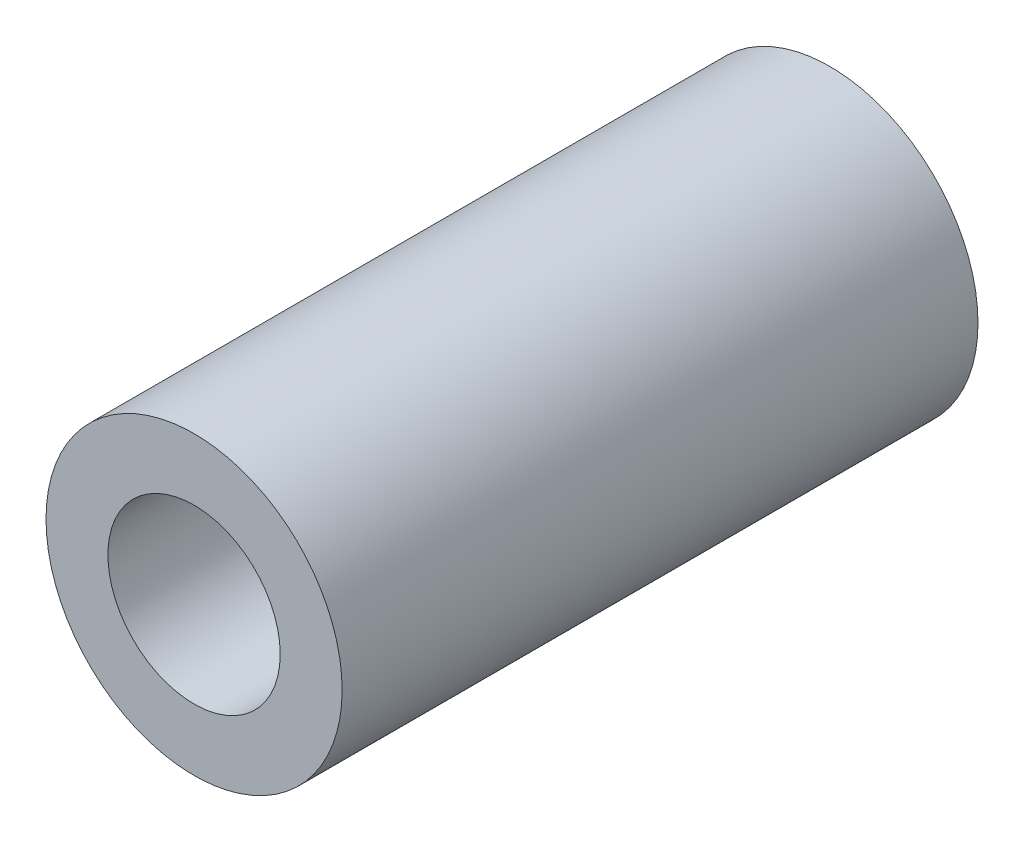
ISO-10303-21;
HEADER;
FILE_DESCRIPTION(('STEP AP214'),'2;1');
FILE_NAME('part.step','',(''),(''),'','','');
FILE_SCHEMA(('AUTOMOTIVE_DESIGN { 1 0 10303 214 1 1 1 1 }'));
ENDSEC;
DATA;
#1=APPLICATION_CONTEXT('core data for automotive mechanical design processes');
#2=APPLICATION_PROTOCOL_DEFINITION('international standard','automotive_design',2000,#1);
#3=PRODUCT_CONTEXT('',#1,'mechanical');
#4=PRODUCT('Part','Part','',(#3));
#5=PRODUCT_RELATED_PRODUCT_CATEGORY('part','',(#4));
#6=PRODUCT_DEFINITION_FORMATION('','',#4);
#7=PRODUCT_DEFINITION_CONTEXT('part definition',#1,'design');
#8=PRODUCT_DEFINITION('design','',#6,#7);
#9=PRODUCT_DEFINITION_SHAPE('','',#8);
#10=(LENGTH_UNIT() NAMED_UNIT(*) SI_UNIT(.MILLI.,.METRE.));
#11=(NAMED_UNIT(*) PLANE_ANGLE_UNIT() SI_UNIT($,.RADIAN.));
#12=(NAMED_UNIT(*) SI_UNIT($,.STERADIAN.) SOLID_ANGLE_UNIT());
#13=UNCERTAINTY_MEASURE_WITH_UNIT(LENGTH_MEASURE(1.E-05),#10,'distance_accuracy_value','');
#14=(GEOMETRIC_REPRESENTATION_CONTEXT(3) GLOBAL_UNCERTAINTY_ASSIGNED_CONTEXT((#13)) GLOBAL_UNIT_ASSIGNED_CONTEXT((#10,
#11,#12)) REPRESENTATION_CONTEXT('',''));
#15=CARTESIAN_POINT('',(0.,0.,0.));
#16=DIRECTION('',(0.,0.,1.));
#17=DIRECTION('',(1.,0.,0.));
#18=AXIS2_PLACEMENT_3D('',#15,#16,#17);
#19=CARTESIAN_POINT('',(0.,0.,11.81));
#20=DIRECTION('',(0.,0.,1.));
#21=DIRECTION('',(1.,0.,0.));
#22=AXIS2_PLACEMENT_3D('',#19,#20,#21);
#23=PLANE('',#22);
#24=CARTESIAN_POINT('',(0.,0.,11.81));
#25=DIRECTION('',(0.,0.,1.));
#26=DIRECTION('',(1.,0.,0.));
#27=AXIS2_PLACEMENT_3D('',#24,#25,#26);
#28=CIRCLE('',#27,2.75);
#29=CARTESIAN_POINT('',(2.75,0.,11.81));
#30=VERTEX_POINT('',#29);
#31=EDGE_CURVE('E10',#30,#30,#28,.T.);
#32=ORIENTED_EDGE('',*,*,#31,.T.);
#33=EDGE_LOOP('',(#32));
#34=FACE_BOUND('',#33,.T.);
#35=CARTESIAN_POINT('',(0.,0.,11.81));
#36=DIRECTION('',(0.,0.,1.));
#37=DIRECTION('',(1.,0.,0.));
#38=AXIS2_PLACEMENT_3D('',#35,#36,#37);
#39=CIRCLE('',#38,1.6);
#40=CARTESIAN_POINT('',(1.6,0.,11.81));
#41=VERTEX_POINT('',#40);
#42=EDGE_CURVE('E42',#41,#41,#39,.T.);
#43=ORIENTED_EDGE('',*,*,#42,.F.);
#44=EDGE_LOOP('',(#43));
#45=FACE_BOUND('',#44,.T.);
#46=ADVANCED_FACE('F31',(#34,#45),#23,.T.);
#47=CARTESIAN_POINT('',(0.,0.,0.));
#48=DIRECTION('',(0.,0.,1.));
#49=DIRECTION('',(1.,0.,0.));
#50=AXIS2_PLACEMENT_3D('',#47,#48,#49);
#51=PLANE('',#50);
#52=CARTESIAN_POINT('',(0.,0.,0.));
#53=DIRECTION('',(0.,0.,1.));
#54=DIRECTION('',(1.,0.,0.));
#55=AXIS2_PLACEMENT_3D('',#52,#53,#54);
#56=CIRCLE('',#55,2.75);
#57=CARTESIAN_POINT('',(2.75,0.,0.));
#58=VERTEX_POINT('',#57);
#59=EDGE_CURVE('E35',#58,#58,#56,.T.);
#60=ORIENTED_EDGE('',*,*,#59,.F.);
#61=EDGE_LOOP('',(#60));
#62=FACE_BOUND('',#61,.T.);
#63=CARTESIAN_POINT('',(0.,0.,0.));
#64=DIRECTION('',(0.,0.,1.));
#65=DIRECTION('',(1.,0.,0.));
#66=AXIS2_PLACEMENT_3D('',#63,#64,#65);
#67=CIRCLE('',#66,1.6);
#68=CARTESIAN_POINT('',(1.6,0.,0.));
#69=VERTEX_POINT('',#68);
#70=EDGE_CURVE('E44',#69,#69,#67,.T.);
#71=ORIENTED_EDGE('',*,*,#70,.T.);
#72=EDGE_LOOP('',(#71));
#73=FACE_BOUND('',#72,.T.);
#74=ADVANCED_FACE('F54',(#62,#73),#51,.F.);
#75=CARTESIAN_POINT('',(0.,0.,11.81));
#76=DIRECTION('',(0.,0.,-1.));
#77=DIRECTION('',(-1.,0.,0.));
#78=AXIS2_PLACEMENT_3D('',#75,#76,#77);
#79=CYLINDRICAL_SURFACE('',#78,2.75);
#80=ORIENTED_EDGE('',*,*,#31,.F.);
#81=EDGE_LOOP('',(#80));
#82=FACE_BOUND('',#81,.T.);
#83=ORIENTED_EDGE('',*,*,#59,.T.);
#84=EDGE_LOOP('',(#83));
#85=FACE_BOUND('',#84,.T.);
#86=ADVANCED_FACE('F33',(#82,#85),#79,.T.);
#87=CARTESIAN_POINT('',(0.,0.,11.81));
#88=DIRECTION('',(0.,0.,-1.));
#89=DIRECTION('',(-1.,0.,0.));
#90=AXIS2_PLACEMENT_3D('',#87,#88,#89);
#91=CYLINDRICAL_SURFACE('',#90,1.6);
#92=ORIENTED_EDGE('',*,*,#42,.T.);
#93=EDGE_LOOP('',(#92));
#94=FACE_BOUND('',#93,.T.);
#95=ORIENTED_EDGE('',*,*,#70,.F.);
#96=EDGE_LOOP('',(#95));
#97=FACE_BOUND('',#96,.T.);
#98=ADVANCED_FACE('F50',(#94,#97),#91,.F.);
#99=CLOSED_SHELL('',(#46,#74,#86,#98));
#100=MANIFOLD_SOLID_BREP('B2',#99);
#101=ADVANCED_BREP_SHAPE_REPRESENTATION('',(#18,#100),#14);
#102=SHAPE_DEFINITION_REPRESENTATION(#9,#101);
ENDSEC;
END-ISO-10303-21;
